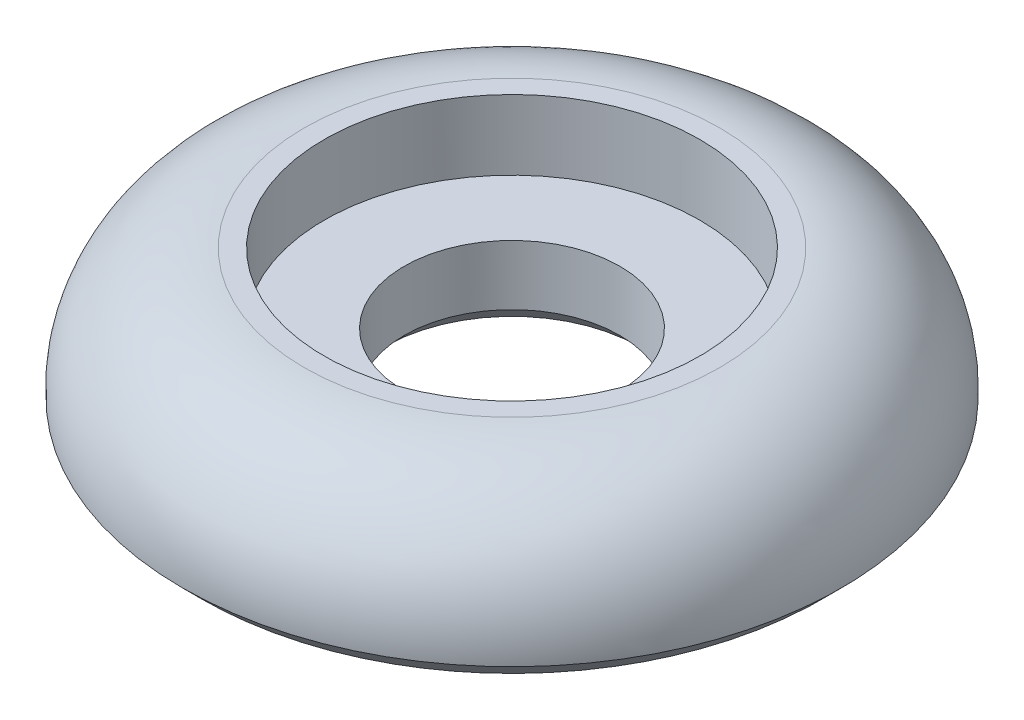
ISO-10303-21;
HEADER;
FILE_DESCRIPTION(('STEP AP214'),'2;1');
FILE_NAME('part.step','',(''),(''),'','','');
FILE_SCHEMA(('AUTOMOTIVE_DESIGN { 1 0 10303 214 1 1 1 1 }'));
ENDSEC;
DATA;
#1=APPLICATION_CONTEXT('core data for automotive mechanical design processes');
#2=APPLICATION_PROTOCOL_DEFINITION('international standard','automotive_design',2000,#1);
#3=PRODUCT_CONTEXT('',#1,'mechanical');
#4=PRODUCT('Part','Part','',(#3));
#5=PRODUCT_RELATED_PRODUCT_CATEGORY('part','',(#4));
#6=PRODUCT_DEFINITION_FORMATION('','',#4);
#7=PRODUCT_DEFINITION_CONTEXT('part definition',#1,'design');
#8=PRODUCT_DEFINITION('design','',#6,#7);
#9=PRODUCT_DEFINITION_SHAPE('','',#8);
#10=(LENGTH_UNIT() NAMED_UNIT(*) SI_UNIT(.MILLI.,.METRE.));
#11=(NAMED_UNIT(*) PLANE_ANGLE_UNIT() SI_UNIT($,.RADIAN.));
#12=(NAMED_UNIT(*) SI_UNIT($,.STERADIAN.) SOLID_ANGLE_UNIT());
#13=UNCERTAINTY_MEASURE_WITH_UNIT(LENGTH_MEASURE(1.E-05),#10,'distance_accuracy_value','');
#14=(GEOMETRIC_REPRESENTATION_CONTEXT(3) GLOBAL_UNCERTAINTY_ASSIGNED_CONTEXT((#13)) GLOBAL_UNIT_ASSIGNED_CONTEXT((#10,
#11,#12)) REPRESENTATION_CONTEXT('',''));
#15=CARTESIAN_POINT('',(0.,0.,0.));
#16=DIRECTION('',(0.,0.,1.));
#17=DIRECTION('',(1.,0.,0.));
#18=AXIS2_PLACEMENT_3D('',#15,#16,#17);
#19=CARTESIAN_POINT('',(-76.2971293989503,3.75,-1.60774429796381));
#20=DIRECTION('',(0.,1.,0.));
#21=DIRECTION('',(0.,0.,1.));
#22=AXIS2_PLACEMENT_3D('',#19,#20,#21);
#23=PLANE('',#22);
#24=CARTESIAN_POINT('',(-69.6971293989503,3.75,4.99225570203619));
#25=DIRECTION('',(0.,-1.,0.));
#26=DIRECTION('',(0.,0.,-1.));
#27=AXIS2_PLACEMENT_3D('',#24,#25,#26);
#28=CIRCLE('',#27,4.7);
#29=CARTESIAN_POINT('',(-69.6971293989503,3.75,0.292255702036193));
#30=VERTEX_POINT('',#29);
#31=EDGE_CURVE('E19',#30,#30,#28,.F.);
#32=ORIENTED_EDGE('',*,*,#31,.F.);
#33=EDGE_LOOP('',(#32));
#34=FACE_BOUND('',#33,.T.);
#35=CARTESIAN_POINT('',(-69.6971293989503,3.74999999999998,4.99225570203619));
#36=DIRECTION('',(0.,-1.,0.));
#37=DIRECTION('',(0.,0.,-1.));
#38=AXIS2_PLACEMENT_3D('',#35,#36,#37);
#39=CIRCLE('',#38,5.2);
#40=CARTESIAN_POINT('',(-69.6971293989503,3.74999999999998,-0.207744297963806));
#41=VERTEX_POINT('',#40);
#42=EDGE_CURVE('E198',#41,#41,#39,.T.);
#43=ORIENTED_EDGE('',*,*,#42,.F.);
#44=EDGE_LOOP('',(#43));
#45=FACE_BOUND('',#44,.T.);
#46=ADVANCED_FACE('F15',(#34,#45),#23,.T.);
#47=CARTESIAN_POINT('',(-69.6971293989503,3.9262,4.99225570203619));
#48=DIRECTION('',(0.,-1.,0.));
#49=DIRECTION('',(0.,0.,-1.));
#50=AXIS2_PLACEMENT_3D('',#47,#48,#49);
#51=CYLINDRICAL_SURFACE('',#50,4.7);
#52=CARTESIAN_POINT('',(-69.6971293989503,2.,4.99225570203619));
#53=DIRECTION('',(0.,1.,0.));
#54=DIRECTION('',(0.,0.,1.));
#55=AXIS2_PLACEMENT_3D('',#52,#53,#54);
#56=CIRCLE('',#55,4.7);
#57=CARTESIAN_POINT('',(-69.6971293989503,2.,9.69225570203619));
#58=VERTEX_POINT('',#57);
#59=EDGE_CURVE('E196',#58,#58,#56,.T.);
#60=ORIENTED_EDGE('',*,*,#59,.F.);
#61=EDGE_LOOP('',(#60));
#62=FACE_BOUND('',#61,.T.);
#63=ORIENTED_EDGE('',*,*,#31,.T.);
#64=EDGE_LOOP('',(#63));
#65=FACE_BOUND('',#64,.T.);
#66=ADVANCED_FACE('F99',(#62,#65),#51,.F.);
#67=CARTESIAN_POINT('',(-75.6971293989503,2.,-1.00774429796381));
#68=DIRECTION('',(0.,1.,0.));
#69=DIRECTION('',(0.,0.,1.));
#70=AXIS2_PLACEMENT_3D('',#67,#68,#69);
#71=PLANE('',#70);
#72=CARTESIAN_POINT('',(-69.6971293989503,2.,4.99225570203619));
#73=DIRECTION('',(0.,-1.,0.));
#74=DIRECTION('',(0.,0.,-1.));
#75=AXIS2_PLACEMENT_3D('',#72,#73,#74);
#76=CIRCLE('',#75,2.7);
#77=CARTESIAN_POINT('',(-69.6971293989503,2.,2.29225570203619));
#78=VERTEX_POINT('',#77);
#79=EDGE_CURVE('E49',#78,#78,#76,.F.);
#80=ORIENTED_EDGE('',*,*,#79,.F.);
#81=EDGE_LOOP('',(#80));
#82=FACE_BOUND('',#81,.T.);
#83=ORIENTED_EDGE('',*,*,#59,.T.);
#84=EDGE_LOOP('',(#83));
#85=FACE_BOUND('',#84,.T.);
#86=ADVANCED_FACE('F91',(#82,#85),#71,.T.);
#87=CARTESIAN_POINT('',(-69.6971293989503,0.693846153846154,4.99225570203619));
#88=DIRECTION('',(0.,-1.,0.));
#89=DIRECTION('',(0.,0.,-1.));
#90=AXIS2_PLACEMENT_3D('',#87,#88,#89);
#91=TOROIDAL_SURFACE('',#90,5.20000000000001,3.05615384615383);
#92=ORIENTED_EDGE('',*,*,#42,.T.);
#93=EDGE_LOOP('',(#92));
#94=FACE_BOUND('',#93,.T.);
#95=CARTESIAN_POINT('',(-69.6971293989503,0.500000000000006,4.99225570203618));
#96=DIRECTION('',(0.,-1.,0.));
#97=DIRECTION('',(1.,0.,0.));
#98=AXIS2_PLACEMENT_3D('',#95,#96,#97);
#99=CIRCLE('',#98,8.25000000000002);
#100=CARTESIAN_POINT('',(-69.6971293989503,0.500000000000005,-3.25774429796381));
#101=VERTEX_POINT('',#100);
#102=CARTESIAN_POINT('',(-69.6971293989503,0.500000000000002,13.2422557020362));
#103=VERTEX_POINT('',#102);
#104=EDGE_CURVE('E51',#101,#103,#99,.T.);
#105=ORIENTED_EDGE('',*,*,#104,.F.);
#106=CARTESIAN_POINT('',(-69.6971293989503,0.500000000000002,4.99225570203619));
#107=DIRECTION('',(0.,-1.,0.));
#108=DIRECTION('',(0.,0.,-1.));
#109=AXIS2_PLACEMENT_3D('',#106,#107,#108);
#110=CIRCLE('',#109,8.24999999999999);
#111=EDGE_CURVE('E43',#103,#101,#110,.T.);
#112=ORIENTED_EDGE('',*,*,#111,.F.);
#113=EDGE_LOOP('',(#105,#112));
#114=FACE_BOUND('',#113,.T.);
#115=ADVANCED_FACE('F52',(#94,#114),#91,.T.);
#116=CARTESIAN_POINT('',(-69.6971293989503,2.1512,4.99225570203619));
#117=DIRECTION('',(0.,-1.,0.));
#118=DIRECTION('',(0.,0.,-1.));
#119=AXIS2_PLACEMENT_3D('',#116,#117,#118);
#120=CYLINDRICAL_SURFACE('',#119,2.7);
#121=CARTESIAN_POINT('',(-69.6971293989503,0.5,4.99225570203619));
#122=DIRECTION('',(0.,1.,0.));
#123=DIRECTION('',(-1.,0.,0.));
#124=AXIS2_PLACEMENT_3D('',#121,#122,#123);
#125=CIRCLE('',#124,2.7);
#126=CARTESIAN_POINT('',(-72.3971293989503,0.5,4.99225570203619));
#127=VERTEX_POINT('',#126);
#128=EDGE_CURVE('E60',#127,#127,#125,.T.);
#129=ORIENTED_EDGE('',*,*,#128,.F.);
#130=EDGE_LOOP('',(#129));
#131=FACE_BOUND('',#130,.T.);
#132=ORIENTED_EDGE('',*,*,#79,.T.);
#133=EDGE_LOOP('',(#132));
#134=FACE_BOUND('',#133,.T.);
#135=ADVANCED_FACE('F90',(#131,#134),#120,.F.);
#136=CARTESIAN_POINT('',(-69.6971293989503,-7.74999999999999,4.99225570203619));
#137=CARTESIAN_POINT('',(-60.6209293989503,1.3262,4.99225570203619));
#138=CARTESIAN_POINT('',(-69.6971293989503,-7.74999999999999,4.99225570203619));
#139=CARTESIAN_POINT('',(-60.6209293989503,1.3262,-4.08394429796379));
#140=CARTESIAN_POINT('',(-69.6971293989503,-7.74999999999999,4.99225570203619));
#141=CARTESIAN_POINT('',(-69.6971293989503,1.3262,-4.08394429796379));
#142=CARTESIAN_POINT('',(-69.6971293989503,-7.74999999999999,4.99225570203619));
#143=CARTESIAN_POINT('',(-78.7733293989503,1.3262,-4.08394429796379));
#144=CARTESIAN_POINT('',(-69.6971293989503,-7.74999999999999,4.99225570203619));
#145=CARTESIAN_POINT('',(-78.7733293989503,1.3262,4.99225570203619));
#146=CARTESIAN_POINT('',(-69.6971293989503,-7.74999999999999,4.99225570203619));
#147=CARTESIAN_POINT('',(-78.7733293989503,1.3262,14.0684557020362));
#148=CARTESIAN_POINT('',(-69.6971293989503,-7.74999999999999,4.99225570203619));
#149=CARTESIAN_POINT('',(-69.6971293989503,1.3262,14.0684557020362));
#150=CARTESIAN_POINT('',(-69.6971293989503,-7.74999999999999,4.99225570203619));
#151=CARTESIAN_POINT('',(-60.6209293989503,1.3262,14.0684557020362));
#152=CARTESIAN_POINT('',(-69.6971293989503,-7.74999999999999,4.99225570203619));
#153=CARTESIAN_POINT('',(-60.6209293989503,1.3262,4.99225570203619));
#154=(BOUNDED_SURFACE() B_SPLINE_SURFACE(2,1,((#136,#137),(#138,#139),(#140,#141),(#142,#143),
(#144,#145),(#146,#147),(#148,#149),(#150,#151),(#152,#153)),.UNSPECIFIED.,.T.,.F.,
.F.) B_SPLINE_SURFACE_WITH_KNOTS((3,2,2,2,3),(2,2),(0.,1.5707963267949,3.14159265358979,
4.71238898038469,6.28318530717959),(0.,12.8356851348107),
.UNSPECIFIED.) GEOMETRIC_REPRESENTATION_ITEM() RATIONAL_B_SPLINE_SURFACE(((1.,1.),
(0.707106781186548,0.707106781186548),(1.,1.),(0.707106781186548,0.707106781186548),(1.,1.),
(0.707106781186548,0.707106781186548),(1.,1.),(0.707106781186548,0.707106781186548),(1.,1.))) REPRESENTATION_ITEM('') SURFACE());
#155=DIRECTION('',(0.,-0.707106781186547,-0.707106781186548));
#156=VECTOR('',#155,1.);
#157=CARTESIAN_POINT('',(-69.6971293989503,-3.2119,9.53035570203619));
#158=LINE('',#157,#156);
#159=CARTESIAN_POINT('',(-69.6971293989503,0.,12.7422557020362));
#160=VERTEX_POINT('',#159);
#161=EDGE_CURVE('E46',#103,#160,#158,.T.);
#162=DIRECTION('',(0.,0.707106781186548,-0.707106781186547));
#163=VECTOR('',#162,1.);
#164=CARTESIAN_POINT('',(-69.6971293989503,-3.2119,0.454155702036199));
#165=LINE('',#164,#163);
#166=CARTESIAN_POINT('',(-69.6971293989503,0.,-2.75774429796379));
#167=VERTEX_POINT('',#166);
#168=EDGE_CURVE('E32',#167,#101,#165,.T.);
#169=CARTESIAN_POINT('',(-69.6971293989503,0.,12.7422557020362));
#170=CARTESIAN_POINT('',(-69.9151005931091,0.,12.7422791382535));
#171=CARTESIAN_POINT('',(-70.1330684181068,0.,12.7330609228124));
#172=CARTESIAN_POINT('',(-70.5674446602107,0.,12.6963104600476));
#173=CARTESIAN_POINT('',(-70.7838531514829,0.,12.6687790896353));
#174=CARTESIAN_POINT('',(-71.2134281937307,0.,12.5955972878236));
#175=CARTESIAN_POINT('',(-71.4265969166036,0.,12.549959606273));
#176=CARTESIAN_POINT('',(-71.8483316178583,0.,12.4408972021913));
#177=CARTESIAN_POINT('',(-72.0568976521378,0.,12.3774726958015));
#178=CARTESIAN_POINT('',(-72.4680066718606,0.,12.2332643488957));
#179=CARTESIAN_POINT('',(-72.6705479150814,0.,12.1524755415484));
#180=CARTESIAN_POINT('',(-73.0681788385571,0.,11.9740911008798));
#181=CARTESIAN_POINT('',(-73.2632657381095,0.,11.876489269134));
#182=CARTESIAN_POINT('',(-73.6444468797305,0.,11.6652346693309));
#183=CARTESIAN_POINT('',(-73.8305445911578,0.,11.5515881611989));
#184=CARTESIAN_POINT('',(-74.1925086419463,0.,11.3090215104004));
#185=CARTESIAN_POINT('',(-74.3683748224894,0.,11.1801011307406));
#186=CARTESIAN_POINT('',(-74.7086229988902,0.,10.9079041905112));
#187=CARTESIAN_POINT('',(-74.8730049657092,0.,10.7646275936432));
#188=CARTESIAN_POINT('',(-75.1891195245007,0.,10.4647333679322));
#189=CARTESIAN_POINT('',(-75.3408518178731,0.,10.3081154243385));
#190=CARTESIAN_POINT('',(-75.6305793972454,0.,9.98266003719224));
#191=CARTESIAN_POINT('',(-75.7685751277918,0.,9.81382298938361));
#192=CARTESIAN_POINT('',(-76.0298995893402,0.,9.46506453332871));
#193=CARTESIAN_POINT('',(-76.1532232248952,0.,9.28513930702702));
#194=CARTESIAN_POINT('',(-76.3842444649939,0.,8.91557925266157));
#195=CARTESIAN_POINT('',(-76.4919456217984,0.,8.72594664518482));
#196=CARTESIAN_POINT('',(-76.6909917354826,0.,8.33827828318378));
#197=CARTESIAN_POINT('',(-76.782336350638,0.,8.1402423532023));
#198=CARTESIAN_POINT('',(-76.9480100926653,0.,7.73719625419398));
#199=CARTESIAN_POINT('',(-77.0223406647392,0.,7.53218667922088));
#200=CARTESIAN_POINT('',(-77.1534692351175,0.,7.11663035594804));
#201=CARTESIAN_POINT('',(-77.2102668674766,0.,6.90608349217424));
#202=CARTESIAN_POINT('',(-77.3059241544699,0.,6.48095135948333));
#203=CARTESIAN_POINT('',(-77.3447836281856,0.,6.26636604985845));
#204=CARTESIAN_POINT('',(-77.4042874940757,0.,5.83468462473556));
#205=CARTESIAN_POINT('',(-77.4249318859663,0.,5.61758850919845));
#206=CARTESIAN_POINT('',(-77.4478592039443,0.,5.18242156762409));
#207=CARTESIAN_POINT('',(-77.450141515308,0.,4.96435070919904));
#208=CARTESIAN_POINT('',(-77.4363269770593,0.,4.52879648912172));
#209=CARTESIAN_POINT('',(-77.4202305113346,0.,4.31131311529344));
#210=CARTESIAN_POINT('',(-77.3697731991374,0.,3.87847307665452));
#211=CARTESIAN_POINT('',(-77.3354121521444,0.,3.66311643521897));
#212=CARTESIAN_POINT('',(-77.2486707641124,0.,3.23606787866956));
#213=CARTESIAN_POINT('',(-77.1962908002886,0.,3.02437588693589));
#214=CARTESIAN_POINT('',(-77.0738727369366,0.,2.60611918872544));
#215=CARTESIAN_POINT('',(-77.003831454516,0.,2.39955541382572));
#216=CARTESIAN_POINT('',(-76.8466208174564,0.,1.99313426152047));
#217=CARTESIAN_POINT('',(-76.7594573984568,0.,1.79327458807063));
#218=CARTESIAN_POINT('',(-76.5685864787915,0.,1.40156573673501));
#219=CARTESIAN_POINT('',(-76.4648755013048,0.,1.2097182530092));
#220=CARTESIAN_POINT('',(-76.241662458423,0.,0.835446608834237));
#221=CARTESIAN_POINT('',(-76.1221607416533,0.,0.65302224046667));
#222=CARTESIAN_POINT('',(-75.8682179245711,0.,0.298894615921001));
#223=CARTESIAN_POINT('',(-75.7337772797403,0.,0.127191033119765));
#224=CARTESIAN_POINT('',(-75.4509116306371,0.,-0.204277800451824));
#225=CARTESIAN_POINT('',(-75.3024868450191,0.,-0.364043237815584));
#226=CARTESIAN_POINT('',(-74.9926990860754,0.,-0.670510093237894));
#227=CARTESIAN_POINT('',(-74.8313355153254,0.,-0.8172109074008));
#228=CARTESIAN_POINT('',(-74.4968813363189,0.,-1.096448866994));
#229=CARTESIAN_POINT('',(-74.3237948029164,0.,-1.22899089309322));
#230=CARTESIAN_POINT('',(-73.9669841773187,0.,-1.47909115955097));
#231=CARTESIAN_POINT('',(-73.7832547391772,0.,-1.59664177311245));
#232=CARTESIAN_POINT('',(-73.406550433227,0.,-1.81584113956467));
#233=CARTESIAN_POINT('',(-73.2135758473462,0.,-1.91749037696021));
#234=CARTESIAN_POINT('',(-72.8196236922277,0.,-2.10422775615888));
#235=CARTESIAN_POINT('',(-72.6186411192449,0.,-2.1893053414046));
#236=CARTESIAN_POINT('',(-72.2102217020897,0.,-2.34221160626526));
#237=CARTESIAN_POINT('',(-72.0027849981787,0.,-2.4100406604326));
#238=CARTESIAN_POINT('',(-71.58320605833,0.,-2.52789347018257));
#239=CARTESIAN_POINT('',(-71.3710701790819,0.,-2.57793988435235));
#240=CARTESIAN_POINT('',(-70.9434219185439,0.,-2.65997419173116));
#241=CARTESIAN_POINT('',(-70.7279112482408,0.,-2.69197094956738));
#242=CARTESIAN_POINT('',(-70.3761311916208,0.,-2.72914247586559));
#243=CARTESIAN_POINT('',(-70.2404249079446,0.,-2.73987499557178));
#244=CARTESIAN_POINT('',(-69.9688602586002,0.,-2.7541707701242));
#245=CARTESIAN_POINT('',(-69.8330025152218,0.,-2.75774584754592));
#246=CARTESIAN_POINT('',(-69.6971293989503,0.,-2.75774429796379));
#247=B_SPLINE_CURVE_WITH_KNOTS('',3,(#169,#170,#171,#172,#173,#174,#175,#176,#177,#178,#179,
#180,#181,#182,#183,#184,#185,#186,#187,#188,#189,#190,#191,#192,#193,#194,#195,#196,#197,#198,
#199,#200,#201,#202,#203,#204,#205,#206,#207,#208,#209,#210,#211,#212,#213,#214,#215,#216,#217,
#218,#219,#220,#221,#222,#223,#224,#225,#226,#227,#228,#229,#230,#231,#232,#233,#234,#235,#236,
#237,#238,#239,#240,#241,#242,#243,#244,#245,#246),.UNSPECIFIED.,.F.,.F.,(4,2,2,2,2,2,2,2,2,2,2,
2,2,2,2,2,2,2,2,2,2,2,2,2,2,2,2,2,2,2,2,2,2,2,2,2,2,2,4),(0.,0.653713991871737,1.30739668339967,
1.9606198884624,2.61383515605105,3.26723751656757,3.92088128320887,4.57427072803732,
5.22767031235322,5.88107154877861,6.5344882046057,7.18788370749204,7.84150546866911,
8.49497837466749,9.14846493157515,9.80189595960006,10.4553406250309,11.1087918807531,
11.7622431466533,12.4157162886296,13.069175781395,13.7226424484113,14.3760954363299,
15.0296662726935,15.6830109377245,16.3364930587468,16.9899607547028,17.6434085321634,
18.2968460940873,18.9503138446738,19.6035556068542,20.2571283875193,20.9106812503577,
21.5646490908437,22.2186027291846,22.8717200881206,23.5245164052789,23.9327330032652,
24.340274755909),.UNSPECIFIED.);
#248=EDGE_CURVE('E37',#160,#167,#247,.T.);
#249=ORIENTED_EDGE('',*,*,#161,.F.);
#250=ORIENTED_EDGE('',*,*,#111,.T.);
#251=ORIENTED_EDGE('',*,*,#168,.F.);
#252=ORIENTED_EDGE('',*,*,#248,.F.);
#253=EDGE_LOOP('',(#249,#250,#251,#252));
#254=FACE_BOUND('',#253,.T.);
#255=ADVANCED_FACE('F45',(#254),#154,.T.);
#256=CARTESIAN_POINT('',(-69.6971293989503,-7.74999999999999,4.99225570203619));
#257=CARTESIAN_POINT('',(-78.7733293989503,1.3262,4.99225570203619));
#258=CARTESIAN_POINT('',(-69.6971293989503,-7.74999999999999,4.99225570203619));
#259=CARTESIAN_POINT('',(-78.7733293989503,1.3262,14.0684557020362));
#260=CARTESIAN_POINT('',(-69.6971293989503,-7.74999999999999,4.99225570203619));
#261=CARTESIAN_POINT('',(-69.6971293989503,1.3262,14.0684557020362));
#262=CARTESIAN_POINT('',(-69.6971293989503,-7.74999999999999,4.99225570203619));
#263=CARTESIAN_POINT('',(-60.6209293989503,1.3262,14.0684557020362));
#264=CARTESIAN_POINT('',(-69.6971293989503,-7.74999999999999,4.99225570203619));
#265=CARTESIAN_POINT('',(-60.6209293989503,1.3262,4.9922557020362));
#266=CARTESIAN_POINT('',(-69.6971293989503,-7.74999999999999,4.99225570203619));
#267=CARTESIAN_POINT('',(-60.6209293989503,1.3262,-4.08394429796379));
#268=CARTESIAN_POINT('',(-69.6971293989503,-7.74999999999999,4.99225570203619));
#269=CARTESIAN_POINT('',(-69.6971293989503,1.3262,-4.08394429796379));
#270=CARTESIAN_POINT('',(-69.6971293989503,-7.74999999999999,4.99225570203619));
#271=CARTESIAN_POINT('',(-78.7733293989503,1.3262,-4.08394429796379));
#272=CARTESIAN_POINT('',(-69.6971293989503,-7.74999999999999,4.99225570203619));
#273=CARTESIAN_POINT('',(-78.7733293989503,1.3262,4.99225570203619));
#274=(BOUNDED_SURFACE() B_SPLINE_SURFACE(2,1,((#256,#257),(#258,#259),(#260,#261),(#262,#263),
(#264,#265),(#266,#267),(#268,#269),(#270,#271),(#272,#273)),.UNSPECIFIED.,.T.,.F.,
.F.) B_SPLINE_SURFACE_WITH_KNOTS((3,2,2,2,3),(2,2),(0.,1.5707963267949,3.14159265358979,
4.71238898038469,6.28318530717959),(0.,12.8356851348107),
.UNSPECIFIED.) GEOMETRIC_REPRESENTATION_ITEM() RATIONAL_B_SPLINE_SURFACE(((1.,1.),
(0.707106781186548,0.707106781186548),(1.,1.),(0.707106781186548,0.707106781186548),(1.,1.),
(0.707106781186548,0.707106781186548),(1.,1.),(0.707106781186548,0.707106781186548),(1.,1.))) REPRESENTATION_ITEM('') SURFACE());
#275=CARTESIAN_POINT('',(-69.6971293989503,0.,-2.75774429796379));
#276=CARTESIAN_POINT('',(-69.4791582047915,0.,-2.75776773418107));
#277=CARTESIAN_POINT('',(-69.2611903797938,0.,-2.74854951874003));
#278=CARTESIAN_POINT('',(-68.8268141376899,0.,-2.7117990559752));
#279=CARTESIAN_POINT('',(-68.6104056464177,0.,-2.68426768556288));
#280=CARTESIAN_POINT('',(-68.1808306041699,0.,-2.61108588375123));
#281=CARTESIAN_POINT('',(-67.967661881297,0.,-2.5654482022006));
#282=CARTESIAN_POINT('',(-67.5459271800423,0.,-2.45638579811884));
#283=CARTESIAN_POINT('',(-67.3373611457627,0.,-2.39296129172912));
#284=CARTESIAN_POINT('',(-66.92625212604,0.,-2.24875294482327));
#285=CARTESIAN_POINT('',(-66.7237108828192,0.,-2.16796413747602));
#286=CARTESIAN_POINT('',(-66.3260799593434,0.,-1.98957969680742));
#287=CARTESIAN_POINT('',(-66.130993059791,0.,-1.8919778650616));
#288=CARTESIAN_POINT('',(-65.74981191817,0.,-1.6807232652585));
#289=CARTESIAN_POINT('',(-65.5637142067428,0.,-1.56707675712652));
#290=CARTESIAN_POINT('',(-65.2017501559543,0.,-1.32451010632801));
#291=CARTESIAN_POINT('',(-65.0258839754112,0.,-1.19558972666814));
#292=CARTESIAN_POINT('',(-64.6856357990104,0.,-0.923392786438783));
#293=CARTESIAN_POINT('',(-64.5212538321914,0.,-0.780116189570758));
#294=CARTESIAN_POINT('',(-64.2051392733999,0.,-0.480221963859814));
#295=CARTESIAN_POINT('',(-64.0534069800274,0.,-0.323604020266043));
#296=CARTESIAN_POINT('',(-63.7636794006552,0.,0.00185136688018287));
#297=CARTESIAN_POINT('',(-63.6256836701087,0.,0.170688414688812));
#298=CARTESIAN_POINT('',(-63.3643592085604,0.,0.519446870743708));
#299=CARTESIAN_POINT('',(-63.2410355730054,0.,0.699372097045408));
#300=CARTESIAN_POINT('',(-63.0100143329067,0.,1.06893215141086));
#301=CARTESIAN_POINT('',(-62.9023131761022,0.,1.25856475888761));
#302=CARTESIAN_POINT('',(-62.7032670624179,0.,1.64623312088865));
#303=CARTESIAN_POINT('',(-62.6119224472626,0.,1.84426905087014));
#304=CARTESIAN_POINT('',(-62.4462487052353,0.,2.24731514987845));
#305=CARTESIAN_POINT('',(-62.3719181331613,0.,2.45232472485155));
#306=CARTESIAN_POINT('',(-62.2407895627831,0.,2.86788104812439));
#307=CARTESIAN_POINT('',(-62.183991930424,0.,3.0784279118982));
#308=CARTESIAN_POINT('',(-62.0883346434307,0.,3.50356004458912));
#309=CARTESIAN_POINT('',(-62.049475169715,0.,3.718145354214));
#310=CARTESIAN_POINT('',(-61.9899713038249,0.,4.14982677933688));
#311=CARTESIAN_POINT('',(-61.9693269119343,0.,4.366922894874));
#312=CARTESIAN_POINT('',(-61.9463995939563,0.,4.80208983644835));
#313=CARTESIAN_POINT('',(-61.9441172825926,0.,5.0201606948734));
#314=CARTESIAN_POINT('',(-61.9579318208414,0.,5.45571491495071));
#315=CARTESIAN_POINT('',(-61.974028286566,0.,5.673198288779));
#316=CARTESIAN_POINT('',(-62.0244855987632,0.,6.10603832741792));
#317=CARTESIAN_POINT('',(-62.0588466457562,0.,6.32139496885347));
#318=CARTESIAN_POINT('',(-62.1455880337882,0.,6.74844352540289));
#319=CARTESIAN_POINT('',(-62.197967997612,0.,6.96013551713655));
#320=CARTESIAN_POINT('',(-62.320386060964,0.,7.378392215347));
#321=CARTESIAN_POINT('',(-62.3904273433846,0.,7.58495599024671));
#322=CARTESIAN_POINT('',(-62.5476379804443,0.,7.99137714255196));
#323=CARTESIAN_POINT('',(-62.6348013994439,0.,8.1912368160018));
#324=CARTESIAN_POINT('',(-62.8256723191091,0.,8.58294566733743));
#325=CARTESIAN_POINT('',(-62.9293832965958,0.,8.77479315106325));
#326=CARTESIAN_POINT('',(-63.1525963394776,0.,9.14906479523821));
#327=CARTESIAN_POINT('',(-63.2720980562473,0.,9.33148916360577));
#328=CARTESIAN_POINT('',(-63.5260408733295,0.,9.68561678815143));
#329=CARTESIAN_POINT('',(-63.6604815181603,0.,9.85732037095267));
#330=CARTESIAN_POINT('',(-63.9433471672635,0.,10.1887892045243));
#331=CARTESIAN_POINT('',(-64.0917719528815,0.,10.348554641888));
#332=CARTESIAN_POINT('',(-64.4015597118252,0.,10.6550214973103));
#333=CARTESIAN_POINT('',(-64.5629232825752,0.,10.8017223114732));
#334=CARTESIAN_POINT('',(-64.8973774615817,0.,11.0809602710664));
#335=CARTESIAN_POINT('',(-65.0704639949842,0.,11.2135022971657));
#336=CARTESIAN_POINT('',(-65.4272746205819,0.,11.4636025636234));
#337=CARTESIAN_POINT('',(-65.6110040587235,0.,11.5811531771849));
#338=CARTESIAN_POINT('',(-65.9877083646737,0.,11.8003525436371));
#339=CARTESIAN_POINT('',(-66.1806829505544,0.,11.9020017810326));
#340=CARTESIAN_POINT('',(-66.574635105673,0.,12.0887391602313));
#341=CARTESIAN_POINT('',(-66.7756176786557,0.,12.173816745477));
#342=CARTESIAN_POINT('',(-67.1840370958109,0.,12.3267230103377));
#343=CARTESIAN_POINT('',(-67.3914737997219,0.,12.394552064505));
#344=CARTESIAN_POINT('',(-67.8110527395706,0.,12.512404874255));
#345=CARTESIAN_POINT('',(-68.0231886188187,0.,12.5624512884248));
#346=CARTESIAN_POINT('',(-68.4508368793567,0.,12.6444855958036));
#347=CARTESIAN_POINT('',(-68.6663475496598,0.,12.6764823536398));
#348=CARTESIAN_POINT('',(-69.0181276062798,0.,12.713653879938));
#349=CARTESIAN_POINT('',(-69.153833889956,0.,12.7243863996442));
#350=CARTESIAN_POINT('',(-69.4253985393004,0.,12.7386821741966));
#351=CARTESIAN_POINT('',(-69.5612562826788,0.,12.7422572516183));
#352=CARTESIAN_POINT('',(-69.6971293989503,0.,12.7422557020362));
#353=B_SPLINE_CURVE_WITH_KNOTS('',3,(#275,#276,#277,#278,#279,#280,#281,#282,#283,#284,#285,
#286,#287,#288,#289,#290,#291,#292,#293,#294,#295,#296,#297,#298,#299,#300,#301,#302,#303,#304,
#305,#306,#307,#308,#309,#310,#311,#312,#313,#314,#315,#316,#317,#318,#319,#320,#321,#322,#323,
#324,#325,#326,#327,#328,#329,#330,#331,#332,#333,#334,#335,#336,#337,#338,#339,#340,#341,#342,
#343,#344,#345,#346,#347,#348,#349,#350,#351,#352),.UNSPECIFIED.,.F.,.F.,(4,2,2,2,2,2,2,2,2,2,2,
2,2,2,2,2,2,2,2,2,2,2,2,2,2,2,2,2,2,2,2,2,2,2,2,2,2,2,4),(0.,0.653713991871737,1.30739668339967,
1.96061988846241,2.61383515605107,3.2672375165676,3.92088128320891,4.57427072803735,
5.22767031235326,5.88107154877865,6.53448820460573,7.18788370749207,7.84150546866913,
8.49497837466752,9.14846493157519,9.8018959596001,10.455340625031,11.1087918807531,
11.7622431466533,12.4157162886296,13.069175781395,13.7226424484113,14.3760954363299,
15.0296662726935,15.6830109377245,16.3364930587469,16.9899607547029,17.6434085321634,
18.2968460940873,18.9503138446738,19.6035556068542,20.2571283875193,20.9106812503578,
21.5646490908437,22.2186027291846,22.8717200881206,23.5245164052789,23.9327330032652,
24.340274755909),.UNSPECIFIED.);
#354=EDGE_CURVE('E24',#167,#160,#353,.T.);
#355=ORIENTED_EDGE('',*,*,#104,.T.);
#356=ORIENTED_EDGE('',*,*,#161,.T.);
#357=ORIENTED_EDGE('',*,*,#354,.F.);
#358=ORIENTED_EDGE('',*,*,#168,.T.);
#359=EDGE_LOOP('',(#355,#356,#357,#358));
#360=FACE_BOUND('',#359,.T.);
#361=ADVANCED_FACE('F55',(#360),#274,.T.);
#362=CARTESIAN_POINT('',(-69.6971293989503,3.2,4.99225570203619));
#363=DIRECTION('',(0.,-1.,0.));
#364=DIRECTION('',(0.,0.,-1.));
#365=AXIS2_PLACEMENT_3D('',#362,#363,#364);
#366=CONICAL_SURFACE('',#365,0.,0.785398163397448);
#367=CARTESIAN_POINT('',(-69.6971293989503,0.,4.99225570203619));
#368=DIRECTION('',(0.,-1.,0.));
#369=DIRECTION('',(0.,0.,-1.));
#370=AXIS2_PLACEMENT_3D('',#367,#368,#369);
#371=CIRCLE('',#370,3.2);
#372=CARTESIAN_POINT('',(-69.6971293989503,0.,1.79225570203619));
#373=VERTEX_POINT('',#372);
#374=EDGE_CURVE('E10',#373,#373,#371,.F.);
#375=ORIENTED_EDGE('',*,*,#374,.F.);
#376=EDGE_LOOP('',(#375));
#377=FACE_BOUND('',#376,.T.);
#378=ORIENTED_EDGE('',*,*,#128,.T.);
#379=EDGE_LOOP('',(#378));
#380=FACE_BOUND('',#379,.T.);
#381=ADVANCED_FACE('F17',(#377,#380),#366,.F.);
#382=CARTESIAN_POINT('',(-79.3571293989503,0.,14.6522557020362));
#383=DIRECTION('',(0.,-1.,0.));
#384=DIRECTION('',(0.,0.,-1.));
#385=AXIS2_PLACEMENT_3D('',#382,#383,#384);
#386=PLANE('',#385);
#387=ORIENTED_EDGE('',*,*,#374,.T.);
#388=EDGE_LOOP('',(#387));
#389=FACE_BOUND('',#388,.T.);
#390=ORIENTED_EDGE('',*,*,#248,.T.);
#391=ORIENTED_EDGE('',*,*,#354,.T.);
#392=EDGE_LOOP('',(#390,#391));
#393=FACE_BOUND('',#392,.T.);
#394=ADVANCED_FACE('F74',(#389,#393),#386,.T.);
#395=CLOSED_SHELL('',(#46,#66,#86,#115,#135,#255,#361,#381,#394));
#396=MANIFOLD_SOLID_BREP('B1',#395);
#397=ADVANCED_BREP_SHAPE_REPRESENTATION('',(#18,#396),#14);
#398=SHAPE_DEFINITION_REPRESENTATION(#9,#397);
ENDSEC;
END-ISO-10303-21;
